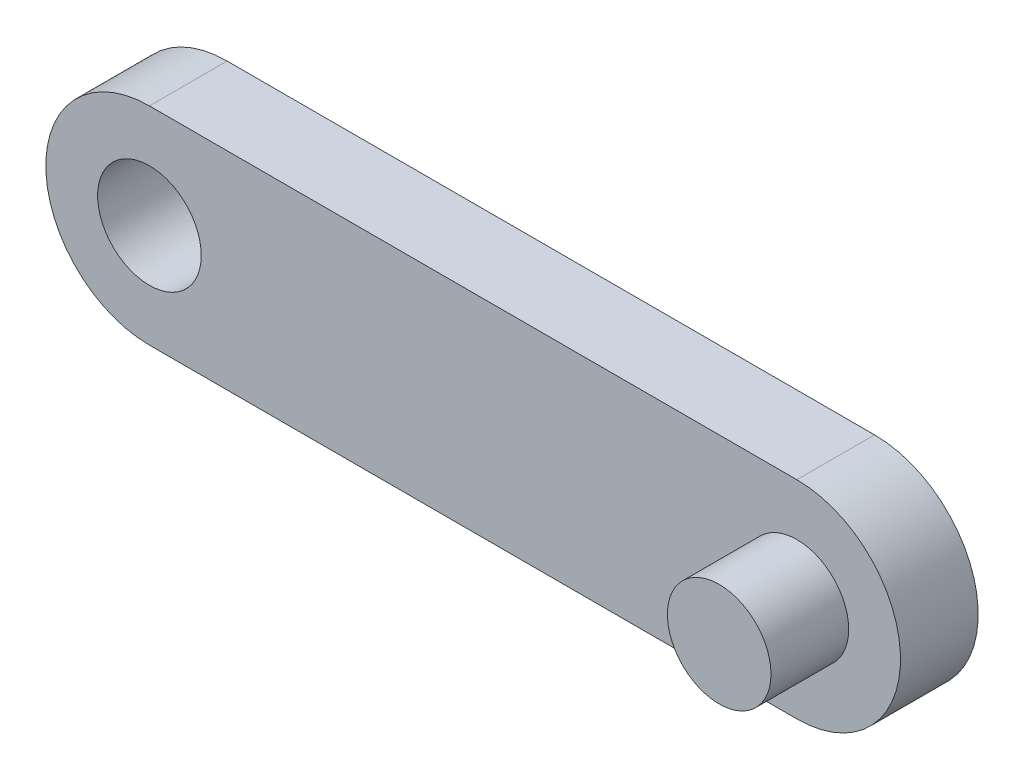
ISO-10303-21;
HEADER;
FILE_DESCRIPTION(('STEP AP214'),'2;1');
FILE_NAME('part.step','',(''),(''),'','','');
FILE_SCHEMA(('AUTOMOTIVE_DESIGN { 1 0 10303 214 1 1 1 1 }'));
ENDSEC;
DATA;
#1=APPLICATION_CONTEXT('core data for automotive mechanical design processes');
#2=APPLICATION_PROTOCOL_DEFINITION('international standard','automotive_design',2000,#1);
#3=PRODUCT_CONTEXT('',#1,'mechanical');
#4=PRODUCT('Part','Part','',(#3));
#5=PRODUCT_RELATED_PRODUCT_CATEGORY('part','',(#4));
#6=PRODUCT_DEFINITION_FORMATION('','',#4);
#7=PRODUCT_DEFINITION_CONTEXT('part definition',#1,'design');
#8=PRODUCT_DEFINITION('design','',#6,#7);
#9=PRODUCT_DEFINITION_SHAPE('','',#8);
#10=(LENGTH_UNIT() NAMED_UNIT(*) SI_UNIT(.MILLI.,.METRE.));
#11=(NAMED_UNIT(*) PLANE_ANGLE_UNIT() SI_UNIT($,.RADIAN.));
#12=(NAMED_UNIT(*) SI_UNIT($,.STERADIAN.) SOLID_ANGLE_UNIT());
#13=UNCERTAINTY_MEASURE_WITH_UNIT(LENGTH_MEASURE(1.E-05),#10,'distance_accuracy_value','');
#14=(GEOMETRIC_REPRESENTATION_CONTEXT(3) GLOBAL_UNCERTAINTY_ASSIGNED_CONTEXT((#13)) GLOBAL_UNIT_ASSIGNED_CONTEXT((#10,
#11,#12)) REPRESENTATION_CONTEXT('',''));
#15=CARTESIAN_POINT('',(0.,0.,0.));
#16=DIRECTION('',(0.,0.,1.));
#17=DIRECTION('',(1.,0.,0.));
#18=AXIS2_PLACEMENT_3D('',#15,#16,#17);
#19=CARTESIAN_POINT('',(0.,-40.,30.));
#20=DIRECTION('',(0.,0.,1.));
#21=DIRECTION('',(1.,0.,0.));
#22=AXIS2_PLACEMENT_3D('',#19,#20,#21);
#23=PLANE('',#22);
#24=CARTESIAN_POINT('',(250.,-40.,30.));
#25=DIRECTION('',(0.,0.,1.));
#26=DIRECTION('',(1.,0.,0.));
#27=AXIS2_PLACEMENT_3D('',#24,#25,#26);
#28=CIRCLE('',#27,20.);
#29=CARTESIAN_POINT('',(270.,-40.,30.));
#30=VERTEX_POINT('',#29);
#31=EDGE_CURVE('E131',#30,#30,#28,.T.);
#32=ORIENTED_EDGE('',*,*,#31,.F.);
#33=EDGE_LOOP('',(#32));
#34=FACE_BOUND('',#33,.T.);
#35=CARTESIAN_POINT('',(0.,-40.,30.));
#36=DIRECTION('',(0.,0.,1.));
#37=DIRECTION('',(1.,0.,0.));
#38=AXIS2_PLACEMENT_3D('',#35,#36,#37);
#39=CIRCLE('',#38,40.);
#40=CARTESIAN_POINT('',(0.,0.,30.));
#41=VERTEX_POINT('',#40);
#42=CARTESIAN_POINT('',(0.,-80.,30.));
#43=VERTEX_POINT('',#42);
#44=EDGE_CURVE('E98',#41,#43,#39,.T.);
#45=ORIENTED_EDGE('',*,*,#44,.T.);
#46=DIRECTION('',(1.,0.,0.));
#47=VECTOR('',#46,1.);
#48=CARTESIAN_POINT('',(0.,-80.,30.));
#49=LINE('',#48,#47);
#50=CARTESIAN_POINT('',(250.,-80.,30.));
#51=VERTEX_POINT('',#50);
#52=EDGE_CURVE('E93',#43,#51,#49,.T.);
#53=ORIENTED_EDGE('',*,*,#52,.T.);
#54=CARTESIAN_POINT('',(250.,-40.,30.));
#55=DIRECTION('',(0.,0.,1.));
#56=DIRECTION('',(1.,0.,0.));
#57=AXIS2_PLACEMENT_3D('',#54,#55,#56);
#58=CIRCLE('',#57,40.);
#59=CARTESIAN_POINT('',(250.,0.,30.));
#60=VERTEX_POINT('',#59);
#61=EDGE_CURVE('E96',#51,#60,#58,.T.);
#62=ORIENTED_EDGE('',*,*,#61,.T.);
#63=DIRECTION('',(-1.,0.,0.));
#64=VECTOR('',#63,1.);
#65=CARTESIAN_POINT('',(0.,0.,30.));
#66=LINE('',#65,#64);
#67=EDGE_CURVE('E63',#60,#41,#66,.T.);
#68=ORIENTED_EDGE('',*,*,#67,.T.);
#69=EDGE_LOOP('',(#45,#53,#62,#68));
#70=FACE_BOUND('',#69,.T.);
#71=CARTESIAN_POINT('',(0.,-40.,30.));
#72=DIRECTION('',(0.,0.,1.));
#73=DIRECTION('',(1.,0.,0.));
#74=AXIS2_PLACEMENT_3D('',#71,#72,#73);
#75=CIRCLE('',#74,20.);
#76=CARTESIAN_POINT('',(20.,-40.,30.));
#77=VERTEX_POINT('',#76);
#78=EDGE_CURVE('E113',#77,#77,#75,.T.);
#79=ORIENTED_EDGE('',*,*,#78,.F.);
#80=EDGE_LOOP('',(#79));
#81=FACE_BOUND('',#80,.T.);
#82=ADVANCED_FACE('F46',(#34,#70,#81),#23,.T.);
#83=CARTESIAN_POINT('',(0.,-40.,0.));
#84=DIRECTION('',(0.,0.,1.));
#85=DIRECTION('',(1.,0.,0.));
#86=AXIS2_PLACEMENT_3D('',#83,#84,#85);
#87=PLANE('',#86);
#88=CARTESIAN_POINT('',(0.,-40.,0.));
#89=DIRECTION('',(0.,0.,1.));
#90=DIRECTION('',(1.,0.,0.));
#91=AXIS2_PLACEMENT_3D('',#88,#89,#90);
#92=CIRCLE('',#91,40.);
#93=CARTESIAN_POINT('',(0.,0.,0.));
#94=VERTEX_POINT('',#93);
#95=CARTESIAN_POINT('',(0.,-80.,0.));
#96=VERTEX_POINT('',#95);
#97=EDGE_CURVE('E110',#94,#96,#92,.T.);
#98=ORIENTED_EDGE('',*,*,#97,.F.);
#99=DIRECTION('',(-1.,0.,0.));
#100=VECTOR('',#99,1.);
#101=CARTESIAN_POINT('',(0.,0.,0.));
#102=LINE('',#101,#100);
#103=CARTESIAN_POINT('',(250.,0.,0.));
#104=VERTEX_POINT('',#103);
#105=EDGE_CURVE('E86',#104,#94,#102,.T.);
#106=ORIENTED_EDGE('',*,*,#105,.F.);
#107=CARTESIAN_POINT('',(250.,-40.,0.));
#108=DIRECTION('',(0.,0.,1.));
#109=DIRECTION('',(1.,0.,0.));
#110=AXIS2_PLACEMENT_3D('',#107,#108,#109);
#111=CIRCLE('',#110,40.);
#112=CARTESIAN_POINT('',(250.,-80.,0.));
#113=VERTEX_POINT('',#112);
#114=EDGE_CURVE('E80',#113,#104,#111,.T.);
#115=ORIENTED_EDGE('',*,*,#114,.F.);
#116=DIRECTION('',(1.,0.,0.));
#117=VECTOR('',#116,1.);
#118=CARTESIAN_POINT('',(0.,-80.,0.));
#119=LINE('',#118,#117);
#120=EDGE_CURVE('E102',#96,#113,#119,.T.);
#121=ORIENTED_EDGE('',*,*,#120,.F.);
#122=EDGE_LOOP('',(#98,#106,#115,#121));
#123=FACE_BOUND('',#122,.T.);
#124=CARTESIAN_POINT('',(0.,-40.,0.));
#125=DIRECTION('',(0.,0.,1.));
#126=DIRECTION('',(1.,0.,0.));
#127=AXIS2_PLACEMENT_3D('',#124,#125,#126);
#128=CIRCLE('',#127,20.);
#129=CARTESIAN_POINT('',(20.,-40.,0.));
#130=VERTEX_POINT('',#129);
#131=EDGE_CURVE('E125',#130,#130,#128,.T.);
#132=ORIENTED_EDGE('',*,*,#131,.T.);
#133=EDGE_LOOP('',(#132));
#134=FACE_BOUND('',#133,.T.);
#135=ADVANCED_FACE('F121',(#123,#134),#87,.F.);
#136=CARTESIAN_POINT('',(0.,-40.,30.));
#137=DIRECTION('',(0.,0.,-1.));
#138=DIRECTION('',(-1.,0.,0.));
#139=AXIS2_PLACEMENT_3D('',#136,#137,#138);
#140=CYLINDRICAL_SURFACE('',#139,40.);
#141=ORIENTED_EDGE('',*,*,#97,.T.);
#142=DIRECTION('',(0.,0.,-1.));
#143=VECTOR('',#142,1.);
#144=CARTESIAN_POINT('',(0.,-80.,30.));
#145=LINE('',#144,#143);
#146=EDGE_CURVE('E13',#43,#96,#145,.T.);
#147=ORIENTED_EDGE('',*,*,#146,.F.);
#148=ORIENTED_EDGE('',*,*,#44,.F.);
#149=DIRECTION('',(0.,0.,-1.));
#150=VECTOR('',#149,1.);
#151=CARTESIAN_POINT('',(0.,0.,30.));
#152=LINE('',#151,#150);
#153=EDGE_CURVE('E106',#41,#94,#152,.T.);
#154=ORIENTED_EDGE('',*,*,#153,.T.);
#155=EDGE_LOOP('',(#141,#147,#148,#154));
#156=FACE_BOUND('',#155,.T.);
#157=ADVANCED_FACE('F48',(#156),#140,.T.);
#158=CARTESIAN_POINT('',(0.,-80.,30.));
#159=DIRECTION('',(0.,1.,0.));
#160=DIRECTION('',(0.,0.,1.));
#161=AXIS2_PLACEMENT_3D('',#158,#159,#160);
#162=PLANE('',#161);
#163=ORIENTED_EDGE('',*,*,#120,.T.);
#164=DIRECTION('',(0.,0.,-1.));
#165=VECTOR('',#164,1.);
#166=CARTESIAN_POINT('',(250.,-80.,30.));
#167=LINE('',#166,#165);
#168=EDGE_CURVE('E55',#51,#113,#167,.T.);
#169=ORIENTED_EDGE('',*,*,#168,.F.);
#170=ORIENTED_EDGE('',*,*,#52,.F.);
#171=ORIENTED_EDGE('',*,*,#146,.T.);
#172=EDGE_LOOP('',(#163,#169,#170,#171));
#173=FACE_BOUND('',#172,.T.);
#174=ADVANCED_FACE('F101',(#173),#162,.F.);
#175=CARTESIAN_POINT('',(250.,-40.,30.));
#176=DIRECTION('',(0.,0.,-1.));
#177=DIRECTION('',(-1.,0.,0.));
#178=AXIS2_PLACEMENT_3D('',#175,#176,#177);
#179=CYLINDRICAL_SURFACE('',#178,40.);
#180=ORIENTED_EDGE('',*,*,#114,.T.);
#181=DIRECTION('',(0.,0.,-1.));
#182=VECTOR('',#181,1.);
#183=CARTESIAN_POINT('',(250.,0.,30.));
#184=LINE('',#183,#182);
#185=EDGE_CURVE('E103',#60,#104,#184,.T.);
#186=ORIENTED_EDGE('',*,*,#185,.F.);
#187=ORIENTED_EDGE('',*,*,#61,.F.);
#188=ORIENTED_EDGE('',*,*,#168,.T.);
#189=EDGE_LOOP('',(#180,#186,#187,#188));
#190=FACE_BOUND('',#189,.T.);
#191=ADVANCED_FACE('F104',(#190),#179,.T.);
#192=CARTESIAN_POINT('',(0.,0.,30.));
#193=DIRECTION('',(0.,-1.,0.));
#194=DIRECTION('',(0.,0.,-1.));
#195=AXIS2_PLACEMENT_3D('',#192,#193,#194);
#196=PLANE('',#195);
#197=ORIENTED_EDGE('',*,*,#105,.T.);
#198=ORIENTED_EDGE('',*,*,#153,.F.);
#199=ORIENTED_EDGE('',*,*,#67,.F.);
#200=ORIENTED_EDGE('',*,*,#185,.T.);
#201=EDGE_LOOP('',(#197,#198,#199,#200));
#202=FACE_BOUND('',#201,.T.);
#203=ADVANCED_FACE('F118',(#202),#196,.F.);
#204=CARTESIAN_POINT('',(0.,-40.,30.));
#205=DIRECTION('',(0.,0.,-1.));
#206=DIRECTION('',(-1.,0.,0.));
#207=AXIS2_PLACEMENT_3D('',#204,#205,#206);
#208=CYLINDRICAL_SURFACE('',#207,20.);
#209=ORIENTED_EDGE('',*,*,#78,.T.);
#210=EDGE_LOOP('',(#209));
#211=FACE_BOUND('',#210,.T.);
#212=ORIENTED_EDGE('',*,*,#131,.F.);
#213=EDGE_LOOP('',(#212));
#214=FACE_BOUND('',#213,.T.);
#215=ADVANCED_FACE('F142',(#211,#214),#208,.F.);
#216=CARTESIAN_POINT('',(250.,-40.,60.));
#217=DIRECTION('',(0.,0.,-1.));
#218=DIRECTION('',(-1.,0.,0.));
#219=AXIS2_PLACEMENT_3D('',#216,#217,#218);
#220=CYLINDRICAL_SURFACE('',#219,20.);
#221=CARTESIAN_POINT('',(250.,-40.,60.));
#222=DIRECTION('',(0.,0.,1.));
#223=DIRECTION('',(1.,0.,0.));
#224=AXIS2_PLACEMENT_3D('',#221,#222,#223);
#225=CIRCLE('',#224,20.);
#226=CARTESIAN_POINT('',(270.,-40.,60.));
#227=VERTEX_POINT('',#226);
#228=EDGE_CURVE('E128',#227,#227,#225,.T.);
#229=ORIENTED_EDGE('',*,*,#228,.F.);
#230=EDGE_LOOP('',(#229));
#231=FACE_BOUND('',#230,.T.);
#232=ORIENTED_EDGE('',*,*,#31,.T.);
#233=EDGE_LOOP('',(#232));
#234=FACE_BOUND('',#233,.T.);
#235=ADVANCED_FACE('F139',(#231,#234),#220,.T.);
#236=CARTESIAN_POINT('',(250.,-40.,60.));
#237=DIRECTION('',(0.,0.,1.));
#238=DIRECTION('',(1.,0.,0.));
#239=AXIS2_PLACEMENT_3D('',#236,#237,#238);
#240=PLANE('',#239);
#241=ORIENTED_EDGE('',*,*,#228,.T.);
#242=EDGE_LOOP('',(#241));
#243=FACE_BOUND('',#242,.T.);
#244=ADVANCED_FACE('F137',(#243),#240,.T.);
#245=CLOSED_SHELL('',(#82,#135,#157,#174,#191,#203,#215,#235,#244));
#246=MANIFOLD_SOLID_BREP('B2',#245);
#247=ADVANCED_BREP_SHAPE_REPRESENTATION('',(#18,#246),#14);
#248=SHAPE_DEFINITION_REPRESENTATION(#9,#247);
ENDSEC;
END-ISO-10303-21;
